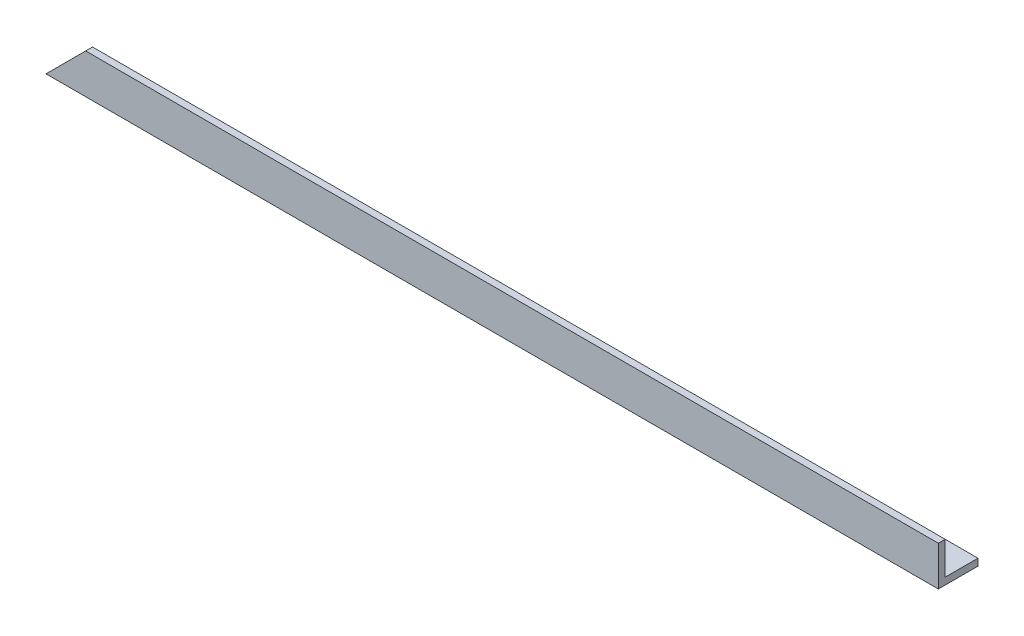
ISO-10303-21;
HEADER;
FILE_DESCRIPTION(('STEP AP214'),'2;1');
FILE_NAME('part.step','',(''),(''),'','','');
FILE_SCHEMA(('AUTOMOTIVE_DESIGN { 1 0 10303 214 1 1 1 1 }'));
ENDSEC;
DATA;
#1=APPLICATION_CONTEXT('core data for automotive mechanical design processes');
#2=APPLICATION_PROTOCOL_DEFINITION('international standard','automotive_design',2000,#1);
#3=PRODUCT_CONTEXT('',#1,'mechanical');
#4=PRODUCT('Part','Part','',(#3));
#5=PRODUCT_RELATED_PRODUCT_CATEGORY('part','',(#4));
#6=PRODUCT_DEFINITION_FORMATION('','',#4);
#7=PRODUCT_DEFINITION_CONTEXT('part definition',#1,'design');
#8=PRODUCT_DEFINITION('design','',#6,#7);
#9=PRODUCT_DEFINITION_SHAPE('','',#8);
#10=(LENGTH_UNIT() NAMED_UNIT(*) SI_UNIT(.MILLI.,.METRE.));
#11=(NAMED_UNIT(*) PLANE_ANGLE_UNIT() SI_UNIT($,.RADIAN.));
#12=(NAMED_UNIT(*) SI_UNIT($,.STERADIAN.) SOLID_ANGLE_UNIT());
#13=UNCERTAINTY_MEASURE_WITH_UNIT(LENGTH_MEASURE(1.E-05),#10,'distance_accuracy_value','');
#14=(GEOMETRIC_REPRESENTATION_CONTEXT(3) GLOBAL_UNCERTAINTY_ASSIGNED_CONTEXT((#13)) GLOBAL_UNIT_ASSIGNED_CONTEXT((#10,
#11,#12)) REPRESENTATION_CONTEXT('',''));
#15=CARTESIAN_POINT('',(0.,0.,0.));
#16=DIRECTION('',(0.,0.,1.));
#17=DIRECTION('',(1.,0.,0.));
#18=AXIS2_PLACEMENT_3D('',#15,#16,#17);
#19=CARTESIAN_POINT('',(450.,20.,0.));
#20=DIRECTION('',(0.,0.,-1.));
#21=DIRECTION('',(0.,1.,0.));
#22=AXIS2_PLACEMENT_3D('',#19,#20,#21);
#23=PLANE('',#22);
#24=DIRECTION('',(-0.707106781186548,-0.707106781186548,0.));
#25=VECTOR('',#24,1.);
#26=CARTESIAN_POINT('',(0.,0.,0.));
#27=LINE('',#26,#25);
#28=CARTESIAN_POINT('',(20.,20.,0.));
#29=VERTEX_POINT('',#28);
#30=CARTESIAN_POINT('',(0.,0.,0.));
#31=VERTEX_POINT('',#30);
#32=EDGE_CURVE('E84',#29,#31,#27,.T.);
#33=ORIENTED_EDGE('',*,*,#32,.T.);
#34=DIRECTION('',(-1.,0.,0.));
#35=VECTOR('',#34,1.);
#36=CARTESIAN_POINT('',(450.,0.,0.));
#37=LINE('',#36,#35);
#38=CARTESIAN_POINT('',(450.,0.,0.));
#39=VERTEX_POINT('',#38);
#40=EDGE_CURVE('E11',#39,#31,#37,.T.);
#41=ORIENTED_EDGE('',*,*,#40,.F.);
#42=DIRECTION('',(0.,-1.,0.));
#43=VECTOR('',#42,1.);
#44=CARTESIAN_POINT('',(450.,20.,0.));
#45=LINE('',#44,#43);
#46=CARTESIAN_POINT('',(450.,20.,0.));
#47=VERTEX_POINT('',#46);
#48=EDGE_CURVE('E106',#47,#39,#45,.T.);
#49=ORIENTED_EDGE('',*,*,#48,.F.);
#50=DIRECTION('',(-1.,0.,0.));
#51=VECTOR('',#50,1.);
#52=CARTESIAN_POINT('',(450.,20.,0.));
#53=LINE('',#52,#51);
#54=EDGE_CURVE('E100',#47,#29,#53,.T.);
#55=ORIENTED_EDGE('',*,*,#54,.T.);
#56=EDGE_LOOP('',(#33,#41,#49,#55));
#57=FACE_BOUND('',#56,.T.);
#58=ADVANCED_FACE('F37',(#57),#23,.F.);
#59=CARTESIAN_POINT('',(450.,0.,-20.));
#60=DIRECTION('',(0.,0.,1.));
#61=DIRECTION('',(1.,0.,0.));
#62=AXIS2_PLACEMENT_3D('',#59,#60,#61);
#63=PLANE('',#62);
#64=DIRECTION('',(-0.707106781186548,-0.707106781186548,0.));
#65=VECTOR('',#64,1.);
#66=CARTESIAN_POINT('',(0.,0.,-20.));
#67=LINE('',#66,#65);
#68=CARTESIAN_POINT('',(3.4611784670157,3.46117846701571,-20.));
#69=VERTEX_POINT('',#68);
#70=CARTESIAN_POINT('',(0.,0.,-20.));
#71=VERTEX_POINT('',#70);
#72=EDGE_CURVE('E95',#69,#71,#67,.T.);
#73=ORIENTED_EDGE('',*,*,#72,.F.);
#74=DIRECTION('',(-1.,0.,0.));
#75=VECTOR('',#74,1.);
#76=CARTESIAN_POINT('',(450.,3.46117846701572,-20.));
#77=LINE('',#76,#75);
#78=CARTESIAN_POINT('',(450.,3.46117846701572,-20.));
#79=VERTEX_POINT('',#78);
#80=EDGE_CURVE('E116',#79,#69,#77,.T.);
#81=ORIENTED_EDGE('',*,*,#80,.F.);
#82=DIRECTION('',(0.,1.,0.));
#83=VECTOR('',#82,1.);
#84=CARTESIAN_POINT('',(450.,0.,-20.));
#85=LINE('',#84,#83);
#86=CARTESIAN_POINT('',(450.,0.,-20.));
#87=VERTEX_POINT('',#86);
#88=EDGE_CURVE('E125',#87,#79,#85,.T.);
#89=ORIENTED_EDGE('',*,*,#88,.F.);
#90=DIRECTION('',(-1.,0.,0.));
#91=VECTOR('',#90,1.);
#92=CARTESIAN_POINT('',(450.,0.,-20.));
#93=LINE('',#92,#91);
#94=EDGE_CURVE('E45',#87,#71,#93,.T.);
#95=ORIENTED_EDGE('',*,*,#94,.T.);
#96=EDGE_LOOP('',(#73,#81,#89,#95));
#97=FACE_BOUND('',#96,.T.);
#98=ADVANCED_FACE('F123',(#97),#63,.F.);
#99=CARTESIAN_POINT('',(450.,3.46117846701572,-20.));
#100=DIRECTION('',(0.,-1.,0.));
#101=DIRECTION('',(0.,0.,-1.));
#102=AXIS2_PLACEMENT_3D('',#99,#100,#101);
#103=PLANE('',#102);
#104=DIRECTION('',(0.,0.,-1.));
#105=VECTOR('',#104,1.);
#106=CARTESIAN_POINT('',(3.46117846701566,3.46117846701572,-20.));
#107=LINE('',#106,#105);
#108=CARTESIAN_POINT('',(3.46117846701574,3.46117846701574,-3.46117846701572));
#109=VERTEX_POINT('',#108);
#110=EDGE_CURVE('E129',#109,#69,#107,.T.);
#111=ORIENTED_EDGE('',*,*,#110,.F.);
#112=DIRECTION('',(-1.,0.,0.));
#113=VECTOR('',#112,1.);
#114=CARTESIAN_POINT('',(450.,3.46117846701572,-3.46117846701572));
#115=LINE('',#114,#113);
#116=CARTESIAN_POINT('',(450.,3.46117846701572,-3.46117846701572));
#117=VERTEX_POINT('',#116);
#118=EDGE_CURVE('E108',#117,#109,#115,.T.);
#119=ORIENTED_EDGE('',*,*,#118,.F.);
#120=DIRECTION('',(0.,0.,1.));
#121=VECTOR('',#120,1.);
#122=CARTESIAN_POINT('',(450.,3.46117846701572,-20.));
#123=LINE('',#122,#121);
#124=EDGE_CURVE('E137',#79,#117,#123,.T.);
#125=ORIENTED_EDGE('',*,*,#124,.F.);
#126=ORIENTED_EDGE('',*,*,#80,.T.);
#127=EDGE_LOOP('',(#111,#119,#125,#126));
#128=FACE_BOUND('',#127,.T.);
#129=ADVANCED_FACE('F146',(#128),#103,.F.);
#130=CARTESIAN_POINT('',(450.,3.46117846701572,-3.46117846701572));
#131=DIRECTION('',(0.,0.,1.));
#132=DIRECTION('',(1.,0.,0.));
#133=AXIS2_PLACEMENT_3D('',#130,#131,#132);
#134=PLANE('',#133);
#135=DIRECTION('',(-0.707106781186548,-0.707106781186548,0.));
#136=VECTOR('',#135,1.);
#137=CARTESIAN_POINT('',(226.730589233508,226.730589233508,-3.46117846701572));
#138=LINE('',#137,#136);
#139=CARTESIAN_POINT('',(20.,20.,-3.46117846701572));
#140=VERTEX_POINT('',#139);
#141=EDGE_CURVE('E104',#140,#109,#138,.T.);
#142=ORIENTED_EDGE('',*,*,#141,.F.);
#143=DIRECTION('',(-1.,0.,0.));
#144=VECTOR('',#143,1.);
#145=CARTESIAN_POINT('',(450.,20.,-3.46117846701572));
#146=LINE('',#145,#144);
#147=CARTESIAN_POINT('',(450.,20.,-3.46117846701572));
#148=VERTEX_POINT('',#147);
#149=EDGE_CURVE('E103',#148,#140,#146,.T.);
#150=ORIENTED_EDGE('',*,*,#149,.F.);
#151=DIRECTION('',(0.,1.,0.));
#152=VECTOR('',#151,1.);
#153=CARTESIAN_POINT('',(450.,3.46117846701572,-3.46117846701572));
#154=LINE('',#153,#152);
#155=EDGE_CURVE('E110',#117,#148,#154,.T.);
#156=ORIENTED_EDGE('',*,*,#155,.F.);
#157=ORIENTED_EDGE('',*,*,#118,.T.);
#158=EDGE_LOOP('',(#142,#150,#156,#157));
#159=FACE_BOUND('',#158,.T.);
#160=ADVANCED_FACE('F144',(#159),#134,.F.);
#161=CARTESIAN_POINT('',(450.,20.,-3.46117846701572));
#162=DIRECTION('',(0.,-1.,0.));
#163=DIRECTION('',(0.,0.,-1.));
#164=AXIS2_PLACEMENT_3D('',#161,#162,#163);
#165=PLANE('',#164);
#166=DIRECTION('',(0.,0.,1.));
#167=VECTOR('',#166,1.);
#168=CARTESIAN_POINT('',(20.,20.,-20.));
#169=LINE('',#168,#167);
#170=EDGE_CURVE('E87',#140,#29,#169,.T.);
#171=ORIENTED_EDGE('',*,*,#170,.T.);
#172=ORIENTED_EDGE('',*,*,#54,.F.);
#173=DIRECTION('',(0.,0.,1.));
#174=VECTOR('',#173,1.);
#175=CARTESIAN_POINT('',(450.,20.,-3.46117846701572));
#176=LINE('',#175,#174);
#177=EDGE_CURVE('E52',#148,#47,#176,.T.);
#178=ORIENTED_EDGE('',*,*,#177,.F.);
#179=ORIENTED_EDGE('',*,*,#149,.T.);
#180=EDGE_LOOP('',(#171,#172,#178,#179));
#181=FACE_BOUND('',#180,.T.);
#182=ADVANCED_FACE('F99',(#181),#165,.F.);
#183=CARTESIAN_POINT('',(450.,0.,0.));
#184=DIRECTION('',(0.,1.,0.));
#185=DIRECTION('',(0.,0.,1.));
#186=AXIS2_PLACEMENT_3D('',#183,#184,#185);
#187=PLANE('',#186);
#188=DIRECTION('',(0.,0.,-1.));
#189=VECTOR('',#188,1.);
#190=CARTESIAN_POINT('',(0.,0.,0.));
#191=LINE('',#190,#189);
#192=EDGE_CURVE('E91',#31,#71,#191,.T.);
#193=ORIENTED_EDGE('',*,*,#192,.T.);
#194=ORIENTED_EDGE('',*,*,#94,.F.);
#195=DIRECTION('',(0.,0.,-1.));
#196=VECTOR('',#195,1.);
#197=CARTESIAN_POINT('',(450.,0.,0.));
#198=LINE('',#197,#196);
#199=EDGE_CURVE('E128',#39,#87,#198,.T.);
#200=ORIENTED_EDGE('',*,*,#199,.F.);
#201=ORIENTED_EDGE('',*,*,#40,.T.);
#202=EDGE_LOOP('',(#193,#194,#200,#201));
#203=FACE_BOUND('',#202,.T.);
#204=ADVANCED_FACE('F127',(#203),#187,.F.);
#205=CARTESIAN_POINT('',(450.,0.,0.));
#206=DIRECTION('',(1.,0.,0.));
#207=DIRECTION('',(0.,0.,-1.));
#208=AXIS2_PLACEMENT_3D('',#205,#206,#207);
#209=PLANE('',#208);
#210=ORIENTED_EDGE('',*,*,#48,.T.);
#211=ORIENTED_EDGE('',*,*,#199,.T.);
#212=ORIENTED_EDGE('',*,*,#88,.T.);
#213=ORIENTED_EDGE('',*,*,#124,.T.);
#214=ORIENTED_EDGE('',*,*,#155,.T.);
#215=ORIENTED_EDGE('',*,*,#177,.T.);
#216=EDGE_LOOP('',(#210,#211,#212,#213,#214,#215));
#217=FACE_BOUND('',#216,.T.);
#218=ADVANCED_FACE('F140',(#217),#209,.T.);
#219=CARTESIAN_POINT('',(0.,0.,-20.));
#220=DIRECTION('',(-0.707106781186548,0.707106781186548,0.));
#221=DIRECTION('',(-0.707106781186548,-0.707106781186548,0.));
#222=AXIS2_PLACEMENT_3D('',#219,#220,#221);
#223=PLANE('',#222);
#224=ORIENTED_EDGE('',*,*,#110,.T.);
#225=ORIENTED_EDGE('',*,*,#72,.T.);
#226=ORIENTED_EDGE('',*,*,#192,.F.);
#227=ORIENTED_EDGE('',*,*,#32,.F.);
#228=ORIENTED_EDGE('',*,*,#170,.F.);
#229=ORIENTED_EDGE('',*,*,#141,.T.);
#230=EDGE_LOOP('',(#224,#225,#226,#227,#228,#229));
#231=FACE_BOUND('',#230,.T.);
#232=ADVANCED_FACE('F86',(#231),#223,.T.);
#233=CLOSED_SHELL('',(#58,#98,#129,#160,#182,#204,#218,#232));
#234=MANIFOLD_SOLID_BREP('B2',#233);
#235=ADVANCED_BREP_SHAPE_REPRESENTATION('',(#18,#234),#14);
#236=SHAPE_DEFINITION_REPRESENTATION(#9,#235);
ENDSEC;
END-ISO-10303-21;
